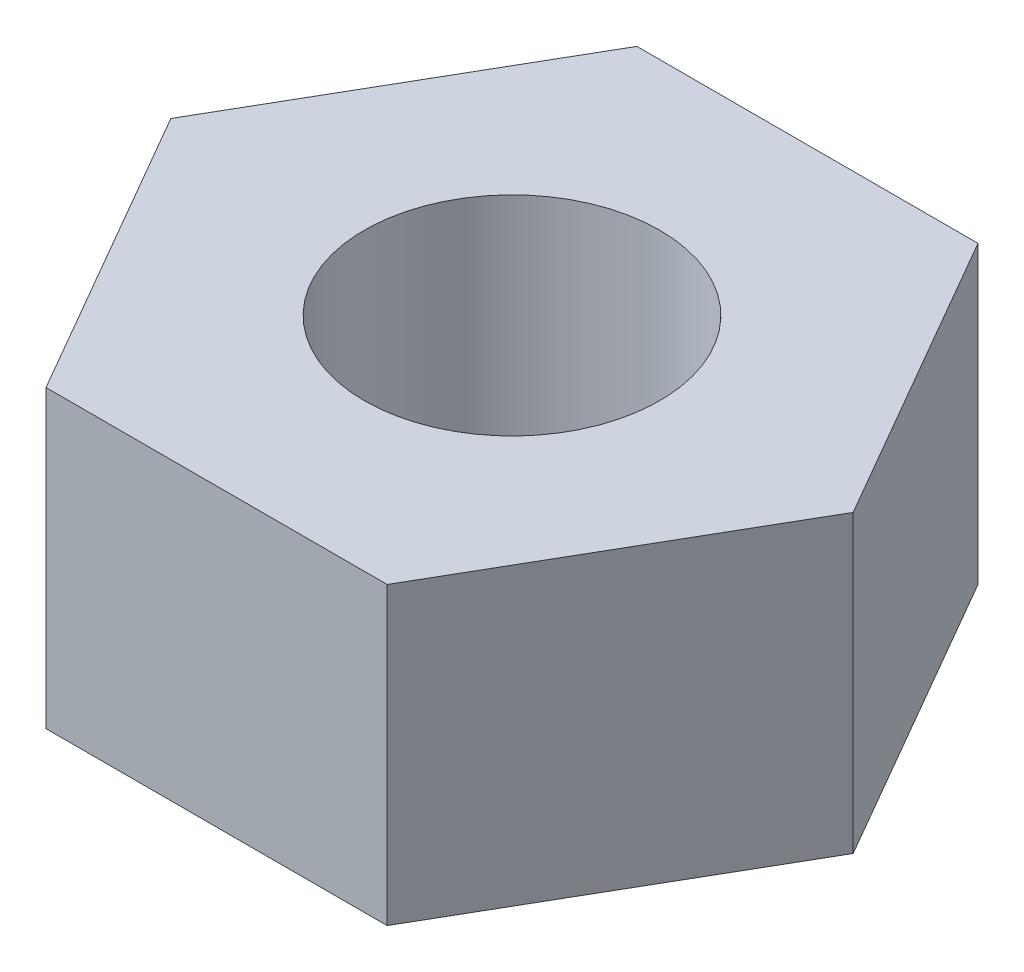
ISO-10303-21;
HEADER;
FILE_DESCRIPTION(('STEP AP214'),'2;1');
FILE_NAME('part.step','',(''),(''),'','','');
FILE_SCHEMA(('AUTOMOTIVE_DESIGN { 1 0 10303 214 1 1 1 1 }'));
ENDSEC;
DATA;
#1=APPLICATION_CONTEXT('core data for automotive mechanical design processes');
#2=APPLICATION_PROTOCOL_DEFINITION('international standard','automotive_design',2000,#1);
#3=PRODUCT_CONTEXT('',#1,'mechanical');
#4=PRODUCT('Part','Part','',(#3));
#5=PRODUCT_RELATED_PRODUCT_CATEGORY('part','',(#4));
#6=PRODUCT_DEFINITION_FORMATION('','',#4);
#7=PRODUCT_DEFINITION_CONTEXT('part definition',#1,'design');
#8=PRODUCT_DEFINITION('design','',#6,#7);
#9=PRODUCT_DEFINITION_SHAPE('','',#8);
#10=(LENGTH_UNIT() NAMED_UNIT(*) SI_UNIT(.MILLI.,.METRE.));
#11=(NAMED_UNIT(*) PLANE_ANGLE_UNIT() SI_UNIT($,.RADIAN.));
#12=(NAMED_UNIT(*) SI_UNIT($,.STERADIAN.) SOLID_ANGLE_UNIT());
#13=UNCERTAINTY_MEASURE_WITH_UNIT(LENGTH_MEASURE(1.E-05),#10,'distance_accuracy_value','');
#14=(GEOMETRIC_REPRESENTATION_CONTEXT(3) GLOBAL_UNCERTAINTY_ASSIGNED_CONTEXT((#13)) GLOBAL_UNIT_ASSIGNED_CONTEXT((#10,
#11,#12)) REPRESENTATION_CONTEXT('',''));
#15=CARTESIAN_POINT('',(0.,0.,0.));
#16=DIRECTION('',(0.,0.,1.));
#17=DIRECTION('',(1.,0.,0.));
#18=AXIS2_PLACEMENT_3D('',#15,#16,#17);
#19=CARTESIAN_POINT('',(0.,1.,0.));
#20=DIRECTION('',(0.,1.,0.));
#21=DIRECTION('',(0.,0.,1.));
#22=AXIS2_PLACEMENT_3D('',#19,#20,#21);
#23=PLANE('',#22);
#24=DIRECTION('',(0.5,0.,-0.866025403784439));
#25=VECTOR('',#24,1.);
#26=CARTESIAN_POINT('',(0.577350269189626,1.,1.));
#27=LINE('',#26,#25);
#28=CARTESIAN_POINT('',(0.577350269189626,1.,1.));
#29=VERTEX_POINT('',#28);
#30=CARTESIAN_POINT('',(1.15470053837925,1.,0.));
#31=VERTEX_POINT('',#30);
#32=EDGE_CURVE('E130',#29,#31,#27,.T.);
#33=ORIENTED_EDGE('',*,*,#32,.T.);
#34=DIRECTION('',(-0.5,0.,-0.866025403784438));
#35=VECTOR('',#34,1.);
#36=CARTESIAN_POINT('',(1.15470053837925,1.,0.));
#37=LINE('',#36,#35);
#38=CARTESIAN_POINT('',(0.577350269189625,1.,-1.));
#39=VERTEX_POINT('',#38);
#40=EDGE_CURVE('E88',#31,#39,#37,.T.);
#41=ORIENTED_EDGE('',*,*,#40,.T.);
#42=DIRECTION('',(-1.,0.,0.));
#43=VECTOR('',#42,1.);
#44=CARTESIAN_POINT('',(0.577350269189625,1.,-1.));
#45=LINE('',#44,#43);
#46=CARTESIAN_POINT('',(-0.577350269189626,1.,-1.));
#47=VERTEX_POINT('',#46);
#48=EDGE_CURVE('E101',#39,#47,#45,.T.);
#49=ORIENTED_EDGE('',*,*,#48,.T.);
#50=DIRECTION('',(-0.5,0.,0.866025403784439));
#51=VECTOR('',#50,1.);
#52=CARTESIAN_POINT('',(-0.577350269189626,1.,-1.));
#53=LINE('',#52,#51);
#54=CARTESIAN_POINT('',(-1.15470053837925,1.,0.));
#55=VERTEX_POINT('',#54);
#56=EDGE_CURVE('E95',#47,#55,#53,.T.);
#57=ORIENTED_EDGE('',*,*,#56,.T.);
#58=DIRECTION('',(0.5,0.,0.866025403784439));
#59=VECTOR('',#58,1.);
#60=CARTESIAN_POINT('',(-1.15470053837925,1.,0.));
#61=LINE('',#60,#59);
#62=CARTESIAN_POINT('',(-0.577350269189626,1.,1.));
#63=VERTEX_POINT('',#62);
#64=EDGE_CURVE('E99',#55,#63,#61,.T.);
#65=ORIENTED_EDGE('',*,*,#64,.T.);
#66=DIRECTION('',(1.,0.,0.));
#67=VECTOR('',#66,1.);
#68=CARTESIAN_POINT('',(-0.577350269189626,1.,1.));
#69=LINE('',#68,#67);
#70=EDGE_CURVE('E51',#63,#29,#69,.T.);
#71=ORIENTED_EDGE('',*,*,#70,.T.);
#72=EDGE_LOOP('',(#33,#41,#49,#57,#65,#71));
#73=FACE_BOUND('',#72,.T.);
#74=CARTESIAN_POINT('',(0.,1.,0.));
#75=DIRECTION('',(0.,1.,0.));
#76=DIRECTION('',(0.,0.,1.));
#77=AXIS2_PLACEMENT_3D('',#74,#75,#76);
#78=CIRCLE('',#77,0.5);
#79=CARTESIAN_POINT('',(0.,1.,0.5));
#80=VERTEX_POINT('',#79);
#81=EDGE_CURVE('E123',#80,#80,#78,.T.);
#82=ORIENTED_EDGE('',*,*,#81,.F.);
#83=EDGE_LOOP('',(#82));
#84=FACE_BOUND('',#83,.T.);
#85=ADVANCED_FACE('F34',(#73,#84),#23,.T.);
#86=CARTESIAN_POINT('',(0.,0.,0.));
#87=DIRECTION('',(0.,1.,0.));
#88=DIRECTION('',(0.,0.,1.));
#89=AXIS2_PLACEMENT_3D('',#86,#87,#88);
#90=PLANE('',#89);
#91=DIRECTION('',(0.5,0.,-0.866025403784439));
#92=VECTOR('',#91,1.);
#93=CARTESIAN_POINT('',(0.577350269189626,0.,1.));
#94=LINE('',#93,#92);
#95=CARTESIAN_POINT('',(0.577350269189626,0.,1.));
#96=VERTEX_POINT('',#95);
#97=CARTESIAN_POINT('',(1.15470053837925,0.,0.));
#98=VERTEX_POINT('',#97);
#99=EDGE_CURVE('E119',#96,#98,#94,.T.);
#100=ORIENTED_EDGE('',*,*,#99,.F.);
#101=DIRECTION('',(1.,0.,0.));
#102=VECTOR('',#101,1.);
#103=CARTESIAN_POINT('',(-0.577350269189626,0.,1.));
#104=LINE('',#103,#102);
#105=CARTESIAN_POINT('',(-0.577350269189626,0.,1.));
#106=VERTEX_POINT('',#105);
#107=EDGE_CURVE('E80',#106,#96,#104,.T.);
#108=ORIENTED_EDGE('',*,*,#107,.F.);
#109=DIRECTION('',(0.5,0.,0.866025403784439));
#110=VECTOR('',#109,1.);
#111=CARTESIAN_POINT('',(-1.15470053837925,0.,0.));
#112=LINE('',#111,#110);
#113=CARTESIAN_POINT('',(-1.15470053837925,0.,0.));
#114=VERTEX_POINT('',#113);
#115=EDGE_CURVE('E74',#114,#106,#112,.T.);
#116=ORIENTED_EDGE('',*,*,#115,.F.);
#117=DIRECTION('',(-0.5,0.,0.866025403784439));
#118=VECTOR('',#117,1.);
#119=CARTESIAN_POINT('',(-0.577350269189626,0.,-1.));
#120=LINE('',#119,#118);
#121=CARTESIAN_POINT('',(-0.577350269189626,0.,-1.));
#122=VERTEX_POINT('',#121);
#123=EDGE_CURVE('E109',#122,#114,#120,.T.);
#124=ORIENTED_EDGE('',*,*,#123,.F.);
#125=DIRECTION('',(-1.,0.,0.));
#126=VECTOR('',#125,1.);
#127=CARTESIAN_POINT('',(0.577350269189625,0.,-1.));
#128=LINE('',#127,#126);
#129=CARTESIAN_POINT('',(0.577350269189625,0.,-1.));
#130=VERTEX_POINT('',#129);
#131=EDGE_CURVE('E125',#130,#122,#128,.T.);
#132=ORIENTED_EDGE('',*,*,#131,.F.);
#133=DIRECTION('',(-0.5,0.,-0.866025403784438));
#134=VECTOR('',#133,1.);
#135=CARTESIAN_POINT('',(1.15470053837925,0.,0.));
#136=LINE('',#135,#134);
#137=EDGE_CURVE('E122',#98,#130,#136,.T.);
#138=ORIENTED_EDGE('',*,*,#137,.F.);
#139=EDGE_LOOP('',(#100,#108,#116,#124,#132,#138));
#140=FACE_BOUND('',#139,.T.);
#141=CARTESIAN_POINT('',(0.,0.,0.));
#142=DIRECTION('',(0.,1.,0.));
#143=DIRECTION('',(0.,0.,1.));
#144=AXIS2_PLACEMENT_3D('',#141,#142,#143);
#145=CIRCLE('',#144,0.5);
#146=CARTESIAN_POINT('',(0.,0.,0.5));
#147=VERTEX_POINT('',#146);
#148=EDGE_CURVE('E223',#147,#147,#145,.T.);
#149=ORIENTED_EDGE('',*,*,#148,.T.);
#150=EDGE_LOOP('',(#149));
#151=FACE_BOUND('',#150,.T.);
#152=ADVANCED_FACE('F139',(#140,#151),#90,.F.);
#153=CARTESIAN_POINT('',(0.577350269189626,1.,1.));
#154=DIRECTION('',(-0.866025403784439,0.,-0.5));
#155=DIRECTION('',(-0.5,0.,0.866025403784439));
#156=AXIS2_PLACEMENT_3D('',#153,#154,#155);
#157=PLANE('',#156);
#158=ORIENTED_EDGE('',*,*,#99,.T.);
#159=DIRECTION('',(0.,-1.,0.));
#160=VECTOR('',#159,1.);
#161=CARTESIAN_POINT('',(1.15470053837925,1.,0.));
#162=LINE('',#161,#160);
#163=EDGE_CURVE('E11',#31,#98,#162,.T.);
#164=ORIENTED_EDGE('',*,*,#163,.F.);
#165=ORIENTED_EDGE('',*,*,#32,.F.);
#166=DIRECTION('',(0.,-1.,0.));
#167=VECTOR('',#166,1.);
#168=CARTESIAN_POINT('',(0.577350269189626,1.,1.));
#169=LINE('',#168,#167);
#170=EDGE_CURVE('E115',#29,#96,#169,.T.);
#171=ORIENTED_EDGE('',*,*,#170,.T.);
#172=EDGE_LOOP('',(#158,#164,#165,#171));
#173=FACE_BOUND('',#172,.T.);
#174=ADVANCED_FACE('F36',(#173),#157,.F.);
#175=CARTESIAN_POINT('',(1.15470053837925,1.,0.));
#176=DIRECTION('',(-0.866025403784438,0.,0.5));
#177=DIRECTION('',(0.5,0.,0.866025403784438));
#178=AXIS2_PLACEMENT_3D('',#175,#176,#177);
#179=PLANE('',#178);
#180=ORIENTED_EDGE('',*,*,#137,.T.);
#181=DIRECTION('',(0.,-1.,0.));
#182=VECTOR('',#181,1.);
#183=CARTESIAN_POINT('',(0.577350269189625,1.,-1.));
#184=LINE('',#183,#182);
#185=EDGE_CURVE('E43',#39,#130,#184,.T.);
#186=ORIENTED_EDGE('',*,*,#185,.F.);
#187=ORIENTED_EDGE('',*,*,#40,.F.);
#188=ORIENTED_EDGE('',*,*,#163,.T.);
#189=EDGE_LOOP('',(#180,#186,#187,#188));
#190=FACE_BOUND('',#189,.T.);
#191=ADVANCED_FACE('F164',(#190),#179,.F.);
#192=CARTESIAN_POINT('',(0.577350269189625,1.,-1.));
#193=DIRECTION('',(0.,0.,1.));
#194=DIRECTION('',(1.,0.,0.));
#195=AXIS2_PLACEMENT_3D('',#192,#193,#194);
#196=PLANE('',#195);
#197=ORIENTED_EDGE('',*,*,#131,.T.);
#198=DIRECTION('',(0.,-1.,0.));
#199=VECTOR('',#198,1.);
#200=CARTESIAN_POINT('',(-0.577350269189626,1.,-1.));
#201=LINE('',#200,#199);
#202=EDGE_CURVE('E110',#47,#122,#201,.T.);
#203=ORIENTED_EDGE('',*,*,#202,.F.);
#204=ORIENTED_EDGE('',*,*,#48,.F.);
#205=ORIENTED_EDGE('',*,*,#185,.T.);
#206=EDGE_LOOP('',(#197,#203,#204,#205));
#207=FACE_BOUND('',#206,.T.);
#208=ADVANCED_FACE('F136',(#207),#196,.F.);
#209=CARTESIAN_POINT('',(-0.577350269189626,1.,-1.));
#210=DIRECTION('',(0.866025403784439,0.,0.5));
#211=DIRECTION('',(0.5,0.,-0.866025403784439));
#212=AXIS2_PLACEMENT_3D('',#209,#210,#211);
#213=PLANE('',#212);
#214=ORIENTED_EDGE('',*,*,#123,.T.);
#215=DIRECTION('',(0.,-1.,0.));
#216=VECTOR('',#215,1.);
#217=CARTESIAN_POINT('',(-1.15470053837925,1.,0.));
#218=LINE('',#217,#216);
#219=EDGE_CURVE('E106',#55,#114,#218,.T.);
#220=ORIENTED_EDGE('',*,*,#219,.F.);
#221=ORIENTED_EDGE('',*,*,#56,.F.);
#222=ORIENTED_EDGE('',*,*,#202,.T.);
#223=EDGE_LOOP('',(#214,#220,#221,#222));
#224=FACE_BOUND('',#223,.T.);
#225=ADVANCED_FACE('F107',(#224),#213,.F.);
#226=CARTESIAN_POINT('',(-1.15470053837925,1.,0.));
#227=DIRECTION('',(0.866025403784439,0.,-0.5));
#228=DIRECTION('',(-0.5,0.,-0.866025403784439));
#229=AXIS2_PLACEMENT_3D('',#226,#227,#228);
#230=PLANE('',#229);
#231=ORIENTED_EDGE('',*,*,#115,.T.);
#232=DIRECTION('',(0.,-1.,0.));
#233=VECTOR('',#232,1.);
#234=CARTESIAN_POINT('',(-0.577350269189626,1.,1.));
#235=LINE('',#234,#233);
#236=EDGE_CURVE('E111',#63,#106,#235,.T.);
#237=ORIENTED_EDGE('',*,*,#236,.F.);
#238=ORIENTED_EDGE('',*,*,#64,.F.);
#239=ORIENTED_EDGE('',*,*,#219,.T.);
#240=EDGE_LOOP('',(#231,#237,#238,#239));
#241=FACE_BOUND('',#240,.T.);
#242=ADVANCED_FACE('F113',(#241),#230,.F.);
#243=CARTESIAN_POINT('',(-0.577350269189626,1.,1.));
#244=DIRECTION('',(0.,0.,-1.));
#245=DIRECTION('',(-1.,0.,0.));
#246=AXIS2_PLACEMENT_3D('',#243,#244,#245);
#247=PLANE('',#246);
#248=ORIENTED_EDGE('',*,*,#107,.T.);
#249=ORIENTED_EDGE('',*,*,#170,.F.);
#250=ORIENTED_EDGE('',*,*,#70,.F.);
#251=ORIENTED_EDGE('',*,*,#236,.T.);
#252=EDGE_LOOP('',(#248,#249,#250,#251));
#253=FACE_BOUND('',#252,.T.);
#254=ADVANCED_FACE('F144',(#253),#247,.F.);
#255=CARTESIAN_POINT('',(0.,1.,0.));
#256=DIRECTION('',(0.,-1.,0.));
#257=DIRECTION('',(0.,0.,-1.));
#258=AXIS2_PLACEMENT_3D('',#255,#256,#257);
#259=CYLINDRICAL_SURFACE('',#258,0.5);
#260=ORIENTED_EDGE('',*,*,#81,.T.);
#261=EDGE_LOOP('',(#260));
#262=FACE_BOUND('',#261,.T.);
#263=ORIENTED_EDGE('',*,*,#148,.F.);
#264=EDGE_LOOP('',(#263));
#265=FACE_BOUND('',#264,.T.);
#266=ADVANCED_FACE('F146',(#262,#265),#259,.F.);
#267=CLOSED_SHELL('',(#85,#152,#174,#191,#208,#225,#242,#254,#266));
#268=MANIFOLD_SOLID_BREP('B2',#267);
#269=ADVANCED_BREP_SHAPE_REPRESENTATION('',(#18,#268),#14);
#270=SHAPE_DEFINITION_REPRESENTATION(#9,#269);
ENDSEC;
END-ISO-10303-21;
